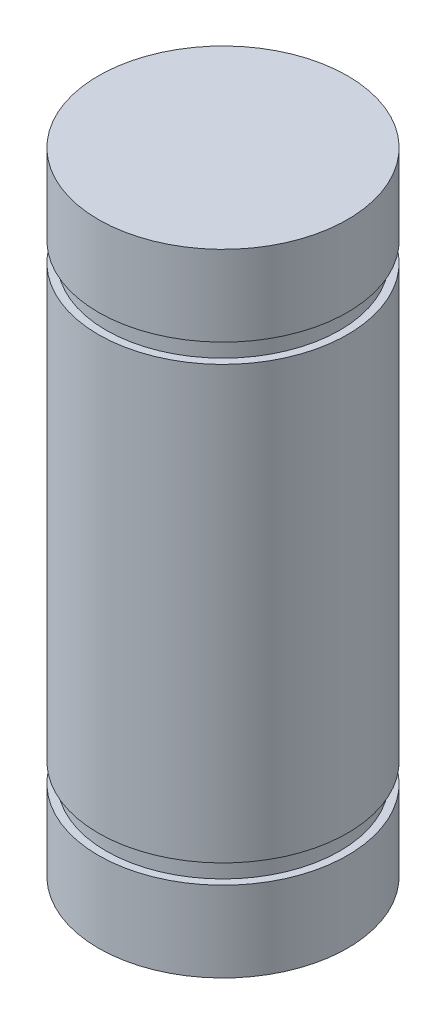
ISO-10303-21;
HEADER;
FILE_DESCRIPTION(('STEP AP214'),'2;1');
FILE_NAME('part.step','',(''),(''),'','','');
FILE_SCHEMA(('AUTOMOTIVE_DESIGN { 1 0 10303 214 1 1 1 1 }'));
ENDSEC;
DATA;
#1=APPLICATION_CONTEXT('core data for automotive mechanical design processes');
#2=APPLICATION_PROTOCOL_DEFINITION('international standard','automotive_design',2000,#1);
#3=PRODUCT_CONTEXT('',#1,'mechanical');
#4=PRODUCT('Part','Part','',(#3));
#5=PRODUCT_RELATED_PRODUCT_CATEGORY('part','',(#4));
#6=PRODUCT_DEFINITION_FORMATION('','',#4);
#7=PRODUCT_DEFINITION_CONTEXT('part definition',#1,'design');
#8=PRODUCT_DEFINITION('design','',#6,#7);
#9=PRODUCT_DEFINITION_SHAPE('','',#8);
#10=(LENGTH_UNIT() NAMED_UNIT(*) SI_UNIT(.MILLI.,.METRE.));
#11=(NAMED_UNIT(*) PLANE_ANGLE_UNIT() SI_UNIT($,.RADIAN.));
#12=(NAMED_UNIT(*) SI_UNIT($,.STERADIAN.) SOLID_ANGLE_UNIT());
#13=UNCERTAINTY_MEASURE_WITH_UNIT(LENGTH_MEASURE(1.E-05),#10,'distance_accuracy_value','');
#14=(GEOMETRIC_REPRESENTATION_CONTEXT(3) GLOBAL_UNCERTAINTY_ASSIGNED_CONTEXT((#13)) GLOBAL_UNIT_ASSIGNED_CONTEXT((#10,
#11,#12)) REPRESENTATION_CONTEXT('',''));
#15=CARTESIAN_POINT('',(0.,0.,0.));
#16=DIRECTION('',(0.,0.,1.));
#17=DIRECTION('',(1.,0.,0.));
#18=AXIS2_PLACEMENT_3D('',#15,#16,#17);
#19=CARTESIAN_POINT('',(0.,12.065,0.));
#20=DIRECTION('',(0.,1.,0.));
#21=DIRECTION('',(0.,0.,1.));
#22=AXIS2_PLACEMENT_3D('',#19,#20,#21);
#23=PLANE('',#22);
#24=CARTESIAN_POINT('',(0.,12.065,0.));
#25=DIRECTION('',(0.,1.,0.));
#26=DIRECTION('',(0.,0.,1.));
#27=AXIS2_PLACEMENT_3D('',#24,#25,#26);
#28=CIRCLE('',#27,4.7625);
#29=CARTESIAN_POINT('',(0.,12.065,4.7625));
#30=VERTEX_POINT('',#29);
#31=EDGE_CURVE('E10',#30,#30,#28,.T.);
#32=ORIENTED_EDGE('',*,*,#31,.T.);
#33=EDGE_LOOP('',(#32));
#34=FACE_BOUND('',#33,.T.);
#35=ADVANCED_FACE('F32',(#34),#23,.T.);
#36=CARTESIAN_POINT('',(0.,8.255,0.));
#37=DIRECTION('',(0.,-1.,0.));
#38=DIRECTION('',(0.,0.,-1.));
#39=AXIS2_PLACEMENT_3D('',#36,#37,#38);
#40=CYLINDRICAL_SURFACE('',#39,4.7625);
#41=CARTESIAN_POINT('',(0.,8.9916,0.));
#42=DIRECTION('',(0.,1.,0.));
#43=DIRECTION('',(0.,0.,1.));
#44=AXIS2_PLACEMENT_3D('',#41,#42,#43);
#45=CIRCLE('',#44,4.7625);
#46=CARTESIAN_POINT('',(0.,8.9916,4.7625));
#47=VERTEX_POINT('',#46);
#48=EDGE_CURVE('E36',#47,#47,#45,.T.);
#49=ORIENTED_EDGE('',*,*,#48,.T.);
#50=EDGE_LOOP('',(#49));
#51=FACE_BOUND('',#50,.T.);
#52=ORIENTED_EDGE('',*,*,#31,.F.);
#53=EDGE_LOOP('',(#52));
#54=FACE_BOUND('',#53,.T.);
#55=ADVANCED_FACE('F34',(#51,#54),#40,.T.);
#56=CARTESIAN_POINT('',(0.,8.9916,0.));
#57=DIRECTION('',(0.,1.,0.));
#58=DIRECTION('',(0.,0.,1.));
#59=AXIS2_PLACEMENT_3D('',#56,#57,#58);
#60=PLANE('',#59);
#61=CARTESIAN_POINT('',(0.,8.9916,0.));
#62=DIRECTION('',(0.,1.,0.));
#63=DIRECTION('',(0.,0.,1.));
#64=AXIS2_PLACEMENT_3D('',#61,#62,#63);
#65=CIRCLE('',#64,4.4704);
#66=CARTESIAN_POINT('',(0.,8.9916,4.4704));
#67=VERTEX_POINT('',#66);
#68=EDGE_CURVE('E43',#67,#67,#65,.T.);
#69=ORIENTED_EDGE('',*,*,#68,.T.);
#70=EDGE_LOOP('',(#69));
#71=FACE_BOUND('',#70,.T.);
#72=ORIENTED_EDGE('',*,*,#48,.F.);
#73=EDGE_LOOP('',(#72));
#74=FACE_BOUND('',#73,.T.);
#75=ADVANCED_FACE('F92',(#71,#74),#60,.F.);
#76=CARTESIAN_POINT('',(0.,21.6358006184654,0.));
#77=DIRECTION('',(0.,-1.,0.));
#78=DIRECTION('',(0.,0.,-1.));
#79=AXIS2_PLACEMENT_3D('',#76,#77,#78);
#80=CYLINDRICAL_SURFACE('',#79,4.4704);
#81=CARTESIAN_POINT('',(0.,8.255,0.));
#82=DIRECTION('',(0.,1.,0.));
#83=DIRECTION('',(0.,0.,1.));
#84=AXIS2_PLACEMENT_3D('',#81,#82,#83);
#85=CIRCLE('',#84,4.4704);
#86=CARTESIAN_POINT('',(0.,8.255,4.4704));
#87=VERTEX_POINT('',#86);
#88=EDGE_CURVE('E47',#87,#87,#85,.T.);
#89=ORIENTED_EDGE('',*,*,#88,.T.);
#90=EDGE_LOOP('',(#89));
#91=FACE_BOUND('',#90,.T.);
#92=ORIENTED_EDGE('',*,*,#68,.F.);
#93=EDGE_LOOP('',(#92));
#94=FACE_BOUND('',#93,.T.);
#95=ADVANCED_FACE('F97',(#91,#94),#80,.T.);
#96=CARTESIAN_POINT('',(0.,-12.065,0.));
#97=DIRECTION('',(0.,-1.,0.));
#98=DIRECTION('',(0.,0.,-1.));
#99=AXIS2_PLACEMENT_3D('',#96,#97,#98);
#100=PLANE('',#99);
#101=CARTESIAN_POINT('',(0.,-12.065,0.));
#102=DIRECTION('',(0.,-1.,0.));
#103=DIRECTION('',(0.,0.,-1.));
#104=AXIS2_PLACEMENT_3D('',#101,#102,#103);
#105=CIRCLE('',#104,4.7625);
#106=CARTESIAN_POINT('',(0.,-12.065,-4.7625));
#107=VERTEX_POINT('',#106);
#108=EDGE_CURVE('E54',#107,#107,#105,.T.);
#109=ORIENTED_EDGE('',*,*,#108,.T.);
#110=EDGE_LOOP('',(#109));
#111=FACE_BOUND('',#110,.T.);
#112=ADVANCED_FACE('F101',(#111),#100,.T.);
#113=CARTESIAN_POINT('',(0.,8.255,0.));
#114=DIRECTION('',(0.,-1.,0.));
#115=DIRECTION('',(0.,0.,-1.));
#116=AXIS2_PLACEMENT_3D('',#113,#114,#115);
#117=CYLINDRICAL_SURFACE('',#116,4.7625);
#118=CARTESIAN_POINT('',(0.,-8.9916,0.));
#119=DIRECTION('',(0.,-1.,0.));
#120=DIRECTION('',(0.,0.,-1.));
#121=AXIS2_PLACEMENT_3D('',#118,#119,#120);
#122=CIRCLE('',#121,4.7625);
#123=CARTESIAN_POINT('',(0.,-8.9916,-4.7625));
#124=VERTEX_POINT('',#123);
#125=EDGE_CURVE('E51',#124,#124,#122,.T.);
#126=ORIENTED_EDGE('',*,*,#125,.T.);
#127=EDGE_LOOP('',(#126));
#128=FACE_BOUND('',#127,.T.);
#129=ORIENTED_EDGE('',*,*,#108,.F.);
#130=EDGE_LOOP('',(#129));
#131=FACE_BOUND('',#130,.T.);
#132=ADVANCED_FACE('F103',(#128,#131),#117,.T.);
#133=CARTESIAN_POINT('',(0.,-8.9916,0.));
#134=DIRECTION('',(0.,-1.,0.));
#135=DIRECTION('',(0.,0.,-1.));
#136=AXIS2_PLACEMENT_3D('',#133,#134,#135);
#137=PLANE('',#136);
#138=CARTESIAN_POINT('',(0.,-8.9916,0.));
#139=DIRECTION('',(0.,1.,0.));
#140=DIRECTION('',(0.,0.,1.));
#141=AXIS2_PLACEMENT_3D('',#138,#139,#140);
#142=CIRCLE('',#141,4.4704);
#143=CARTESIAN_POINT('',(0.,-8.9916,4.4704));
#144=VERTEX_POINT('',#143);
#145=EDGE_CURVE('E50',#144,#144,#142,.T.);
#146=ORIENTED_EDGE('',*,*,#145,.F.);
#147=EDGE_LOOP('',(#146));
#148=FACE_BOUND('',#147,.T.);
#149=ORIENTED_EDGE('',*,*,#125,.F.);
#150=EDGE_LOOP('',(#149));
#151=FACE_BOUND('',#150,.T.);
#152=ADVANCED_FACE('F83',(#148,#151),#137,.F.);
#153=CARTESIAN_POINT('',(0.,4.38920061846536,0.));
#154=DIRECTION('',(0.,-1.,0.));
#155=DIRECTION('',(0.,0.,-1.));
#156=AXIS2_PLACEMENT_3D('',#153,#154,#155);
#157=CYLINDRICAL_SURFACE('',#156,4.4704);
#158=CARTESIAN_POINT('',(0.,-8.255,0.));
#159=DIRECTION('',(0.,-1.,0.));
#160=DIRECTION('',(0.,0.,-1.));
#161=AXIS2_PLACEMENT_3D('',#158,#159,#160);
#162=CIRCLE('',#161,4.4704);
#163=CARTESIAN_POINT('',(0.,-8.255,-4.4704));
#164=VERTEX_POINT('',#163);
#165=EDGE_CURVE('E55',#164,#164,#162,.T.);
#166=ORIENTED_EDGE('',*,*,#165,.T.);
#167=EDGE_LOOP('',(#166));
#168=FACE_BOUND('',#167,.T.);
#169=ORIENTED_EDGE('',*,*,#145,.T.);
#170=EDGE_LOOP('',(#169));
#171=FACE_BOUND('',#170,.T.);
#172=ADVANCED_FACE('F74',(#168,#171),#157,.T.);
#173=CARTESIAN_POINT('',(0.,8.255,0.));
#174=DIRECTION('',(0.,-1.,0.));
#175=DIRECTION('',(0.,0.,-1.));
#176=AXIS2_PLACEMENT_3D('',#173,#174,#175);
#177=CYLINDRICAL_SURFACE('',#176,4.7625);
#178=CARTESIAN_POINT('',(0.,-8.255,0.));
#179=DIRECTION('',(0.,-1.,0.));
#180=DIRECTION('',(0.,0.,-1.));
#181=AXIS2_PLACEMENT_3D('',#178,#179,#180);
#182=CIRCLE('',#181,4.7625);
#183=CARTESIAN_POINT('',(0.,-8.255,-4.7625));
#184=VERTEX_POINT('',#183);
#185=EDGE_CURVE('E63',#184,#184,#182,.T.);
#186=ORIENTED_EDGE('',*,*,#185,.F.);
#187=EDGE_LOOP('',(#186));
#188=FACE_BOUND('',#187,.T.);
#189=CARTESIAN_POINT('',(0.,8.255,0.));
#190=DIRECTION('',(0.,1.,0.));
#191=DIRECTION('',(0.,0.,1.));
#192=AXIS2_PLACEMENT_3D('',#189,#190,#191);
#193=CIRCLE('',#192,4.7625);
#194=CARTESIAN_POINT('',(0.,8.255,4.7625));
#195=VERTEX_POINT('',#194);
#196=EDGE_CURVE('E60',#195,#195,#193,.T.);
#197=ORIENTED_EDGE('',*,*,#196,.F.);
#198=EDGE_LOOP('',(#197));
#199=FACE_BOUND('',#198,.T.);
#200=ADVANCED_FACE('F71',(#188,#199),#177,.T.);
#201=CARTESIAN_POINT('',(0.,-8.255,0.));
#202=DIRECTION('',(0.,-1.,0.));
#203=DIRECTION('',(0.,0.,-1.));
#204=AXIS2_PLACEMENT_3D('',#201,#202,#203);
#205=PLANE('',#204);
#206=ORIENTED_EDGE('',*,*,#165,.F.);
#207=EDGE_LOOP('',(#206));
#208=FACE_BOUND('',#207,.T.);
#209=ORIENTED_EDGE('',*,*,#185,.T.);
#210=EDGE_LOOP('',(#209));
#211=FACE_BOUND('',#210,.T.);
#212=ADVANCED_FACE('F73',(#208,#211),#205,.T.);
#213=CARTESIAN_POINT('',(0.,8.255,0.));
#214=DIRECTION('',(0.,1.,0.));
#215=DIRECTION('',(0.,0.,1.));
#216=AXIS2_PLACEMENT_3D('',#213,#214,#215);
#217=PLANE('',#216);
#218=ORIENTED_EDGE('',*,*,#88,.F.);
#219=EDGE_LOOP('',(#218));
#220=FACE_BOUND('',#219,.T.);
#221=ORIENTED_EDGE('',*,*,#196,.T.);
#222=EDGE_LOOP('',(#221));
#223=FACE_BOUND('',#222,.T.);
#224=ADVANCED_FACE('F69',(#220,#223),#217,.T.);
#225=CLOSED_SHELL('',(#35,#55,#75,#95,#112,#132,#152,#172,#200,#212,#224));
#226=MANIFOLD_SOLID_BREP('B2',#225);
#227=ADVANCED_BREP_SHAPE_REPRESENTATION('',(#18,#226),#14);
#228=SHAPE_DEFINITION_REPRESENTATION(#9,#227);
ENDSEC;
END-ISO-10303-21;
